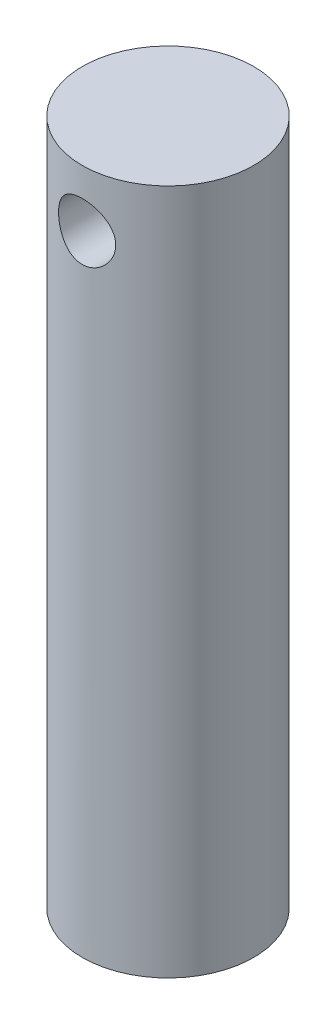
ISO-10303-21;
HEADER;
FILE_DESCRIPTION(('STEP AP214'),'2;1');
FILE_NAME('part.step','',(''),(''),'','','');
FILE_SCHEMA(('AUTOMOTIVE_DESIGN { 1 0 10303 214 1 1 1 1 }'));
ENDSEC;
DATA;
#1=APPLICATION_CONTEXT('core data for automotive mechanical design processes');
#2=APPLICATION_PROTOCOL_DEFINITION('international standard','automotive_design',2000,#1);
#3=PRODUCT_CONTEXT('',#1,'mechanical');
#4=PRODUCT('Part','Part','',(#3));
#5=PRODUCT_RELATED_PRODUCT_CATEGORY('part','',(#4));
#6=PRODUCT_DEFINITION_FORMATION('','',#4);
#7=PRODUCT_DEFINITION_CONTEXT('part definition',#1,'design');
#8=PRODUCT_DEFINITION('design','',#6,#7);
#9=PRODUCT_DEFINITION_SHAPE('','',#8);
#10=(LENGTH_UNIT() NAMED_UNIT(*) SI_UNIT(.MILLI.,.METRE.));
#11=(NAMED_UNIT(*) PLANE_ANGLE_UNIT() SI_UNIT($,.RADIAN.));
#12=(NAMED_UNIT(*) SI_UNIT($,.STERADIAN.) SOLID_ANGLE_UNIT());
#13=UNCERTAINTY_MEASURE_WITH_UNIT(LENGTH_MEASURE(1.E-05),#10,'distance_accuracy_value','');
#14=(GEOMETRIC_REPRESENTATION_CONTEXT(3) GLOBAL_UNCERTAINTY_ASSIGNED_CONTEXT((#13)) GLOBAL_UNIT_ASSIGNED_CONTEXT((#10,
#11,#12)) REPRESENTATION_CONTEXT('',''));
#15=CARTESIAN_POINT('',(0.,0.,0.));
#16=DIRECTION('',(0.,0.,1.));
#17=DIRECTION('',(1.,0.,0.));
#18=AXIS2_PLACEMENT_3D('',#15,#16,#17);
#19=CARTESIAN_POINT('',(0.,600.,0.));
#20=DIRECTION('',(0.,-1.,0.));
#21=DIRECTION('',(0.,0.,-1.));
#22=AXIS2_PLACEMENT_3D('',#19,#20,#21);
#23=CYLINDRICAL_SURFACE('',#22,75.);
#24=CARTESIAN_POINT('',(0.,575.,-75.));
#25=CARTESIAN_POINT('',(-0.682043563109411,575.000000281202,-75.0000001834636));
#26=CARTESIAN_POINT('',(-1.36408304916086,574.972066630301,-74.9906750346958));
#27=CARTESIAN_POINT('',(-2.72309062655188,574.86060349026,-74.9536313305163));
#28=CARTESIAN_POINT('',(-3.40005875906055,574.777074452937,-74.9259129245845));
#29=CARTESIAN_POINT('',(-4.74402781816825,574.555205586026,-74.852836749776));
#30=CARTESIAN_POINT('',(-5.41102796618303,574.416861497897,-74.8074776104087));
#31=CARTESIAN_POINT('',(-6.73027957356999,574.086629626201,-74.7003437610052));
#32=CARTESIAN_POINT('',(-7.38253093274908,573.894741479012,-74.6385689394884));
#33=CARTESIAN_POINT('',(-8.66673818011844,573.45946596057,-74.5003628053537));
#34=CARTESIAN_POINT('',(-9.2987269417531,573.216167431924,-74.4239567980684));
#35=CARTESIAN_POINT('',(-10.5394907998742,572.679857633823,-74.2584063686388));
#36=CARTESIAN_POINT('',(-11.1482659624174,572.386846505844,-74.1692619827463));
#37=CARTESIAN_POINT('',(-12.3389551597216,571.753276330204,-73.9804948316014));
#38=CARTESIAN_POINT('',(-12.9208652540418,571.412710336717,-73.8808705361871));
#39=CARTESIAN_POINT('',(-14.054294697475,570.686467156375,-73.6736642826246));
#40=CARTESIAN_POINT('',(-14.6058132850364,570.300788839847,-73.5660821252261));
#41=CARTESIAN_POINT('',(-15.6920909239394,569.474045311492,-73.3421793403497));
#42=CARTESIAN_POINT('',(-16.2257890481614,569.031626754044,-73.2256907515636));
#43=CARTESIAN_POINT('',(-16.997046245371,568.336311758575,-73.0490936667679));
#44=CARTESIAN_POINT('',(-17.2492628938853,568.099245506629,-72.9899140882099));
#45=CARTESIAN_POINT('',(-17.7436742741242,567.614818226839,-72.8713019644221));
#46=CARTESIAN_POINT('',(-17.9858665374623,567.367454693136,-72.8118693608145));
#47=CARTESIAN_POINT('',(-18.6967642907861,566.610542173006,-72.6338050100808));
#48=CARTESIAN_POINT('',(-19.1498502873156,566.086117574569,-72.5153929461569));
#49=CARTESIAN_POINT('',(-20.0112963600764,565.000931067295,-72.2824129533261));
#50=CARTESIAN_POINT('',(-20.419656643914,564.440169327144,-72.1678450065775));
#51=CARTESIAN_POINT('',(-21.0021289120157,563.566060488429,-71.9996736602132));
#52=CARTESIAN_POINT('',(-21.1937292728482,563.264742433966,-71.9434719995578));
#53=CARTESIAN_POINT('',(-21.5639770024164,562.653948776773,-71.833363944514));
#54=CARTESIAN_POINT('',(-21.7426274852462,562.344475159807,-71.7794569996042));
#55=CARTESIAN_POINT('',(-22.2587291653832,561.404380781866,-71.6217741443237));
#56=CARTESIAN_POINT('',(-22.5763641930188,560.762036088602,-71.5220264055396));
#57=CARTESIAN_POINT('',(-23.1558370084906,559.450973910466,-71.3365252223791));
#58=CARTESIAN_POINT('',(-23.4176880867469,558.78226275245,-71.2507684458253));
#59=CARTESIAN_POINT('',(-23.8833575556511,557.423016669667,-71.0960301875004));
#60=CARTESIAN_POINT('',(-24.0871785581008,556.73248272865,-71.0270479507657));
#61=CARTESIAN_POINT('',(-24.4289109763763,555.35840813644,-70.9102237330429));
#62=CARTESIAN_POINT('',(-24.5688117194695,554.675415779862,-70.8617477779742));
#63=CARTESIAN_POINT('',(-24.7911720822714,553.299043392663,-70.7842616932367));
#64=CARTESIAN_POINT('',(-24.873632895037,552.605663578101,-70.7552511592615));
#65=CARTESIAN_POINT('',(-24.9802500996108,551.21406813829,-70.7176803518508));
#66=CARTESIAN_POINT('',(-25.0044220685952,550.515853855041,-70.709114614731));
#67=CARTESIAN_POINT('',(-24.9942512753776,549.119915662094,-70.7127106595401));
#68=CARTESIAN_POINT('',(-24.9599101642946,548.422191739113,-70.7248718565975));
#69=CARTESIAN_POINT('',(-24.8359880589053,547.064546278223,-70.7684797128405));
#70=CARTESIAN_POINT('',(-24.7490073200895,546.404356175383,-70.79901820523));
#71=CARTESIAN_POINT('',(-24.5229215709178,545.094054363806,-70.8776454461219));
#72=CARTESIAN_POINT('',(-24.3838183868932,544.443942302772,-70.9257335796966));
#73=CARTESIAN_POINT('',(-24.0547093125451,543.158112935513,-71.0380260010566));
#74=CARTESIAN_POINT('',(-23.8646992143096,542.522396823954,-71.1022316210687));
#75=CARTESIAN_POINT('',(-23.4353812932918,541.269506928207,-71.2448877174833));
#76=CARTESIAN_POINT('',(-23.1960721614449,540.652333636895,-71.3233385721408));
#77=CARTESIAN_POINT('',(-22.6657350080684,539.430468969774,-71.4936585294983));
#78=CARTESIAN_POINT('',(-22.3739377450668,538.826137500952,-71.5857229839322));
#79=CARTESIAN_POINT('',(-21.9012134949576,537.939773188544,-71.7311925034584));
#80=CARTESIAN_POINT('',(-21.7377918910674,537.647660190712,-71.7809137455381));
#81=CARTESIAN_POINT('',(-21.3994922936759,537.070434952941,-71.8824939586225));
#82=CARTESIAN_POINT('',(-21.2246117957602,536.785324262248,-71.9343533960191));
#83=CARTESIAN_POINT('',(-20.6832345812266,535.941171409029,-72.0926154985117));
#84=CARTESIAN_POINT('',(-20.2999786221414,535.393264395711,-72.2017092681118));
#85=CARTESIAN_POINT('',(-19.4912940646186,534.330431041641,-72.4242034100678));
#86=CARTESIAN_POINT('',(-19.065863975155,533.815505867991,-72.5376039345974));
#87=CARTESIAN_POINT('',(-18.3864103798326,533.05705917426,-72.7117489086873));
#88=CARTESIAN_POINT('',(-18.1466543586881,532.800518492736,-72.7719904513457));
#89=CARTESIAN_POINT('',(-17.6566121114811,532.297818078898,-72.8924393524401));
#90=CARTESIAN_POINT('',(-17.4063283596204,532.051655934375,-72.9526467155748));
#91=CARTESIAN_POINT('',(-16.6401117339339,531.329182979027,-73.1326316378779));
#92=CARTESIAN_POINT('',(-16.1087833639113,530.868852024296,-73.2517798327651));
#93=CARTESIAN_POINT('',(-15.0085818114725,529.994086453637,-73.4850920999277));
#94=CARTESIAN_POINT('',(-14.4397046570499,529.579656705714,-73.5992556427848));
#95=CARTESIAN_POINT('',(-13.2679127368396,528.799579986111,-73.819494651593));
#96=CARTESIAN_POINT('',(-12.6649982157431,528.433932663805,-73.9255701756753));
#97=CARTESIAN_POINT('',(-11.4228250318291,527.750809483968,-74.1277202605017));
#98=CARTESIAN_POINT('',(-10.7832636501069,527.433850921548,-74.2236844190991));
#99=CARTESIAN_POINT('',(-9.47771346683198,526.855178772997,-74.4016593358158));
#100=CARTESIAN_POINT('',(-8.81172432707068,526.593465894141,-74.4836699152933));
#101=CARTESIAN_POINT('',(-7.45830492187188,526.12772121586,-74.6313398868872));
#102=CARTESIAN_POINT('',(-6.7708807568148,525.923673168491,-74.6970038842794));
#103=CARTESIAN_POINT('',(-5.37962867496845,525.575140036193,-74.8100699301734));
#104=CARTESIAN_POINT('',(-4.67580151473701,525.430652209882,-74.8574728191741));
#105=CARTESIAN_POINT('',(-3.28807672782372,525.20764593431,-74.9309699436454));
#106=CARTESIAN_POINT('',(-2.60463843291338,525.126538419255,-74.9578990919435));
#107=CARTESIAN_POINT('',(-1.23292734578024,525.020948214852,-74.9930031690901));
#108=CARTESIAN_POINT('',(-0.544654694045821,524.996463886783,-75.001178640685));
#109=CARTESIAN_POINT('',(0.831420089689477,525.00435846384,-74.9985472444385));
#110=CARTESIAN_POINT('',(1.51922227695571,525.036728802602,-74.9877432362589));
#111=CARTESIAN_POINT('',(2.88926550971048,525.157998028435,-74.9474602198848));
#112=CARTESIAN_POINT('',(3.57150661128805,525.24689634465,-74.9179814002808));
#113=CARTESIAN_POINT('',(4.905692902917,525.476968625908,-74.8422852599859));
#114=CARTESIAN_POINT('',(5.55794265508157,525.616550260369,-74.7965786528855));
#115=CARTESIAN_POINT('',(6.84798644252094,525.946966349266,-74.6895174337568));
#116=CARTESIAN_POINT('',(7.48578083352989,526.137799540958,-74.6281632072594));
#117=CARTESIAN_POINT('',(8.74283207145607,526.56915527054,-74.4913597379428));
#118=CARTESIAN_POINT('',(9.36208731817853,526.809682083629,-74.4159092824627));
#119=CARTESIAN_POINT('',(10.5781511094928,527.338525242007,-74.25280595869));
#120=CARTESIAN_POINT('',(11.1749590199595,527.626842936122,-74.1651527460044));
#121=CARTESIAN_POINT('',(12.3580261922201,528.257412679975,-73.9773423147337));
#122=CARTESIAN_POINT('',(12.9435958091378,528.600883230655,-73.8769169808463));
#123=CARTESIAN_POINT('',(13.7986502989285,529.150248889151,-73.7202914105832));
#124=CARTESIAN_POINT('',(14.0797992454848,529.339074858367,-73.6670820171242));
#125=CARTESIAN_POINT('',(14.634050391862,529.727872005998,-73.5589851007624));
#126=CARTESIAN_POINT('',(14.9071507637923,529.927845686774,-73.5040972023389));
#127=CARTESIAN_POINT('',(15.7137307029732,530.543987475894,-73.3374392742958));
#128=CARTESIAN_POINT('',(16.2345200648313,530.976396241948,-73.2236692804721));
#129=CARTESIAN_POINT('',(17.2390522633139,531.881714258543,-72.9937029966343));
#130=CARTESIAN_POINT('',(17.7227941301181,532.354624568637,-72.8775066432047));
#131=CARTESIAN_POINT('',(18.4290370243459,533.103386597144,-72.7009843095927));
#132=CARTESIAN_POINT('',(18.6660685958202,533.365614110157,-72.640450603467));
#133=CARTESIAN_POINT('',(19.1288083165228,533.899889113788,-72.5199685168573));
#134=CARTESIAN_POINT('',(19.3545191259199,534.171934271361,-72.4600200015562));
#135=CARTESIAN_POINT('',(20.0142374861073,535.002333255599,-72.2816563222532));
#136=CARTESIAN_POINT('',(20.4308640776165,535.574985697855,-72.1647146593224));
#137=CARTESIAN_POINT('',(21.2146058778503,536.754545708368,-71.9382167205842));
#138=CARTESIAN_POINT('',(21.5817192919298,537.361454517144,-71.8286607125479));
#139=CARTESIAN_POINT('',(22.2637288544633,538.605720496069,-71.62020361494));
#140=CARTESIAN_POINT('',(22.5786259090552,539.243077137593,-71.5213023404817));
#141=CARTESIAN_POINT('',(23.1530379513559,540.542697116014,-71.3374213013824));
#142=CARTESIAN_POINT('',(23.4126611638089,541.204908738887,-71.2524144091771));
#143=CARTESIAN_POINT('',(23.8749983682163,542.550792076995,-71.0988316549189));
#144=CARTESIAN_POINT('',(24.0777121681878,543.234463864619,-71.0302558482961));
#145=CARTESIAN_POINT('',(24.424198622974,544.617917039961,-70.9118614022397));
#146=CARTESIAN_POINT('',(24.5679935067317,545.317692246743,-70.8620356893462));
#147=CARTESIAN_POINT('',(24.7952587358922,546.72810584243,-70.782834772265));
#148=CARTESIAN_POINT('',(24.8787321213794,547.438743682036,-70.7534585374668));
#149=CARTESIAN_POINT('',(24.9817457004329,548.828415967245,-70.7171488916618));
#150=CARTESIAN_POINT('',(25.004352346477,549.507196736511,-70.7091392426977));
#151=CARTESIAN_POINT('',(24.9942676756856,550.864281233426,-70.712704882972));
#152=CARTESIAN_POINT('',(24.9615783456059,551.542584977337,-70.724279468559));
#153=CARTESIAN_POINT('',(24.8412320095267,552.893638724134,-70.766639253225));
#154=CARTESIAN_POINT('',(24.7535784284975,553.566389070419,-70.7974232553131));
#155=CARTESIAN_POINT('',(24.5241549685574,554.901490903276,-70.8772215873113));
#156=CARTESIAN_POINT('',(24.3823849166255,555.563842356592,-70.9262359755076));
#157=CARTESIAN_POINT('',(24.0492503260876,556.861006629382,-71.0398751986922));
#158=CARTESIAN_POINT('',(23.8588825598618,557.496103713742,-71.1041846928451));
#159=CARTESIAN_POINT('',(23.4289341274567,558.74773797922,-71.2470091657171));
#160=CARTESIAN_POINT('',(23.1893543731931,559.36427550401,-71.325523881205));
#161=CARTESIAN_POINT('',(22.6627859748553,560.575163442805,-71.494577034191));
#162=CARTESIAN_POINT('',(22.3757893476576,561.169510100055,-71.5851174958442));
#163=CARTESIAN_POINT('',(21.7564744266566,562.332474798277,-71.7757673164203));
#164=CARTESIAN_POINT('',(21.4241544890965,562.90109190511,-71.8758770223551));
#165=CARTESIAN_POINT('',(20.7008573285621,564.033721820906,-72.0876031729989));
#166=CARTESIAN_POINT('',(20.3079531427272,564.596450712472,-72.1995311221473));
#167=CARTESIAN_POINT('',(19.6854290942786,565.414323367691,-72.370782835824));
#168=CARTESIAN_POINT('',(19.4723800811053,565.68259195639,-72.4284300731229));
#169=CARTESIAN_POINT('',(19.0354736837794,566.210121920355,-72.5444818740063));
#170=CARTESIAN_POINT('',(18.8116137734136,566.469381165807,-72.6028866122433));
#171=CARTESIAN_POINT('',(18.1243577926126,567.233009899806,-72.7786453215333));
#172=CARTESIAN_POINT('',(17.6452591265925,567.723264986679,-72.8965511095064));
#173=CARTESIAN_POINT('',(16.6482057618157,568.662972328376,-73.1307006826635));
#174=CARTESIAN_POINT('',(16.1302507495481,569.112424253916,-73.2469444544285));
#175=CARTESIAN_POINT('',(15.3160765068676,569.76220501363,-73.4200169892604));
#176=CARTESIAN_POINT('',(15.0328433222103,569.978504668062,-73.478566786181));
#177=CARTESIAN_POINT('',(14.4572405045122,570.398901834738,-73.5939831879275));
#178=CARTESIAN_POINT('',(14.1648730566885,570.603002231922,-73.6508501890901));
#179=CARTESIAN_POINT('',(13.2745815728358,571.19655892762,-73.8183573231869));
#180=CARTESIAN_POINT('',(12.6634280954844,571.567302899787,-73.9259122425388));
#181=CARTESIAN_POINT('',(11.4103488270383,572.25567354728,-74.129662678448));
#182=CARTESIAN_POINT('',(10.7684292405709,572.573310875155,-74.2258604719667));
#183=CARTESIAN_POINT('',(9.45803560059031,573.152941103816,-74.4041840010504));
#184=CARTESIAN_POINT('',(8.78956292433632,573.414936886162,-74.486310465298));
#185=CARTESIAN_POINT('',(7.46128971124123,573.870481722736,-74.630793567644));
#186=CARTESIAN_POINT('',(6.80243588202987,574.066565693947,-74.6938695005434));
#187=CARTESIAN_POINT('',(5.46950089439773,574.404039498885,-74.8032862174244));
#188=CARTESIAN_POINT('',(4.79542023653629,574.54543112778,-74.8496275506829));
#189=CARTESIAN_POINT('',(3.43706552511666,574.772174027218,-74.9242893320059));
#190=CARTESIAN_POINT('',(2.75279386252671,574.857538237267,-74.9526139409776));
#191=CARTESIAN_POINT('',(1.37901340142224,574.971451003272,-74.9904691563562));
#192=CARTESIAN_POINT('',(0.689504617338183,574.999999715722,-74.9999998145295));
#193=CARTESIAN_POINT('',(0.,575.,-75.));
#194=B_SPLINE_CURVE_WITH_KNOTS('',3,(#24,#25,#26,#27,#28,#29,#30,#31,#32,#33,#34,#35,#36,#37,
#38,#39,#40,#41,#42,#43,#44,#45,#46,#47,#48,#49,#50,#51,#52,#53,#54,#55,#56,#57,#58,#59,#60,#61,
#62,#63,#64,#65,#66,#67,#68,#69,#70,#71,#72,#73,#74,#75,#76,#77,#78,#79,#80,#81,#82,#83,#84,#85,
#86,#87,#88,#89,#90,#91,#92,#93,#94,#95,#96,#97,#98,#99,#100,#101,#102,#103,#104,#105,#106,#107,
#108,#109,#110,#111,#112,#113,#114,#115,#116,#117,#118,#119,#120,#121,#122,#123,#124,#125,#126,
#127,#128,#129,#130,#131,#132,#133,#134,#135,#136,#137,#138,#139,#140,#141,#142,#143,#144,#145,
#146,#147,#148,#149,#150,#151,#152,#153,#154,#155,#156,#157,#158,#159,#160,#161,#162,#163,#164,
#165,#166,#167,#168,#169,#170,#171,#172,#173,#174,#175,#176,#177,#178,#179,#180,#181,#182,#183,
#184,#185,#186,#187,#188,#189,#190,#191,#192,#193),.UNSPECIFIED.,.T.,.F.,(4,2,2,2,2,2,2,2,2,2,2,
2,2,2,2,2,2,2,2,2,2,2,2,2,2,2,2,2,2,2,2,2,2,2,2,2,2,2,2,2,2,2,2,2,2,2,2,2,2,2,2,2,2,2,2,2,2,2,2,
2,2,2,2,2,2,2,2,2,2,2,2,2,2,2,2,2,2,2,2,2,2,2,2,2,4),(0.,2.04549108001866,4.09096553676624,
6.13659893608049,8.18224622784603,10.2243869189781,12.2665217985551,14.3089552632997,
16.3514398841596,18.4576962856669,19.5109360455847,20.5644336288988,22.6711854870895,
24.7779275658136,25.8620480619015,26.9459069855851,29.1134413481503,31.2804587208075,
33.4473785455136,35.5412876392246,37.6351532400667,39.7284592118682,41.8217061158565,
43.8191456437848,45.8165151894739,47.8140498865896,49.8116376321865,51.8413229504077,
52.8562642771743,53.8714281705366,55.9016049419061,57.931853513842,59.0003750321555,
60.0686468170587,62.2050533722456,64.3416862852946,66.4783038402626,68.6362496637018,
70.7942231123077,72.9515879114232,75.1088534022356,77.1725684100928,79.2362236916498,
81.299568066371,83.3628916044167,85.3663222396702,87.3697035185469,89.373257222384,
91.3768674830872,93.4331444713402,94.4613906112772,95.4898685015544,97.5467128261631,
99.6036109759403,100.679204052578,101.754543189192,103.905075004321,106.055684746285,
108.206257163679,110.352579282526,112.498908641865,114.644427486273,116.789838193225,
118.824943015843,120.859974719751,122.894879627957,124.929791042207,126.925917091913,
128.922006156024,130.918431625578,132.91492951948,134.998557644853,136.040490005586,
137.082667026973,139.166889163095,141.251128117494,142.334309450023,143.417233604746,
145.582925564431,147.748182590008,149.913327454023,151.981746146051,154.050096940562,
156.117969882205,158.185837128055),.UNSPECIFIED.);
#195=CARTESIAN_POINT('',(0.,575.,-75.));
#196=VERTEX_POINT('',#195);
#197=EDGE_CURVE('E10',#196,#196,#194,.T.);
#198=ORIENTED_EDGE('',*,*,#197,.T.);
#199=EDGE_LOOP('',(#198));
#200=FACE_BOUND('',#199,.T.);
#201=CARTESIAN_POINT('',(25.0000000000001,550.,70.7106781186547));
#202=CARTESIAN_POINT('',(25.0000002905048,549.31914529342,70.7106778950988));
#203=CARTESIAN_POINT('',(24.972163123343,548.638294743538,70.7205384082539));
#204=CARTESIAN_POINT('',(24.8610943853675,547.281699610562,70.7596596623775));
#205=CARTESIAN_POINT('',(24.7778632142728,546.605954990661,70.7889202633563));
#206=CARTESIAN_POINT('',(24.5568065668124,545.26444738065,70.8659079550308));
#207=CARTESIAN_POINT('',(24.4189739218801,544.598685713108,70.9136374704705));
#208=CARTESIAN_POINT('',(24.0900031573892,543.281943728838,71.0260650188068));
#209=CARTESIAN_POINT('',(23.8988645794935,542.630963539257,71.0907631976037));
#210=CARTESIAN_POINT('',(23.465398463372,541.349467547839,71.2350130583448));
#211=CARTESIAN_POINT('',(23.2231745119017,540.718913268466,71.3145346452564));
#212=CARTESIAN_POINT('',(22.6892737023302,539.480907465289,71.4861904894017));
#213=CARTESIAN_POINT('',(22.3975969925086,538.873455872222,71.5783247088172));
#214=CARTESIAN_POINT('',(21.7669109510884,537.685208028436,71.7726300786875));
#215=CARTESIAN_POINT('',(21.4278937432057,537.104416234656,71.8748028984762));
#216=CARTESIAN_POINT('',(20.7048826041899,535.972932386585,72.0864042278168));
#217=CARTESIAN_POINT('',(20.3208874434561,535.422241155784,72.1958329356937));
#218=CARTESIAN_POINT('',(19.4959470435702,534.335069515787,72.4230451906923));
#219=CARTESIAN_POINT('',(19.0534630630533,533.799789294909,72.5409874455801));
#220=CARTESIAN_POINT('',(18.1257009001659,532.768044053839,72.7783497638775));
#221=CARTESIAN_POINT('',(17.6404218247488,532.271579844067,72.897769858082));
#222=CARTESIAN_POINT('',(16.6299627800379,531.320443845132,73.1349002504791));
#223=CARTESIAN_POINT('',(16.1047766851179,530.865778495754,73.2526102828651));
#224=CARTESIAN_POINT('',(15.0177288069339,530.001247532193,73.483171487966));
#225=CARTESIAN_POINT('',(14.4558666767878,529.591382341828,73.5960226147087));
#226=CARTESIAN_POINT('',(13.2837211191846,528.809151341475,73.8167159840747));
#227=CARTESIAN_POINT('',(12.6725555111639,528.438046965378,73.9243499724011));
#228=CARTESIAN_POINT('',(11.4191909295395,527.748852785535,74.128301991135));
#229=CARTESIAN_POINT('',(10.7769912564603,527.43076417743,74.2246197663189));
#230=CARTESIAN_POINT('',(9.46612023751601,526.850350915807,74.4031583831655));
#231=CARTESIAN_POINT('',(8.7974544429863,526.588014640857,74.4853821619931));
#232=CARTESIAN_POINT('',(7.43838739678039,526.121421398038,74.6333538833669));
#233=CARTESIAN_POINT('',(6.74798707716808,525.917161943361,74.6991025313524));
#234=CARTESIAN_POINT('',(5.37503029481823,525.57476578286,74.8102050121057));
#235=CARTESIAN_POINT('',(4.69303653716876,525.434575928394,74.8561887905591));
#236=CARTESIAN_POINT('',(3.31875501323107,525.211486071131,74.929695711808));
#237=CARTESIAN_POINT('',(2.6264674645984,525.128584858756,74.9572192443678));
#238=CARTESIAN_POINT('',(1.23704408416943,525.020905830528,74.993016762765));
#239=CARTESIAN_POINT('',(0.539909361449459,524.996115130701,75.001295015566));
#240=CARTESIAN_POINT('',(-0.853944505265173,525.004871059726,74.9983762571751));
#241=CARTESIAN_POINT('',(-1.55066365850778,525.038416337943,74.9871796968774));
#242=CARTESIAN_POINT('',(-2.91101012746152,525.161039371296,74.9464529595546));
#243=CARTESIAN_POINT('',(-3.57486228535946,525.247883987561,74.9176602240251));
#244=CARTESIAN_POINT('',(-4.89252326214549,525.474297655795,74.8431603599659));
#245=CARTESIAN_POINT('',(-5.54633239063485,525.613865079043,74.7974537539424));
#246=CARTESIAN_POINT('',(-6.83949116877275,525.944506389571,74.6903095410896));
#247=CARTESIAN_POINT('',(-7.47884028036368,526.135582190071,74.6288713499322));
#248=CARTESIAN_POINT('',(-8.7388619289851,526.567630022038,74.4918385969254));
#249=CARTESIAN_POINT('',(-9.3595340513401,526.808603160415,74.4162437210313));
#250=CARTESIAN_POINT('',(-10.5864011754736,527.342081243865,74.2517075327204));
#251=CARTESIAN_POINT('',(-11.1922996928288,527.635220373701,74.1626042363106));
#252=CARTESIAN_POINT('',(-12.0808553093815,528.110143310438,74.0212338058597));
#253=CARTESIAN_POINT('',(-12.3736722452885,528.274328844025,73.972821870832));
#254=CARTESIAN_POINT('',(-12.9522432444177,528.614210909204,73.8737134440178));
#255=CARTESIAN_POINT('',(-13.2379957328101,528.789909976124,73.8230164498239));
#256=CARTESIAN_POINT('',(-14.0839580257333,529.333806738497,73.6679759149813));
#257=CARTESIAN_POINT('',(-14.632925457052,529.718832238592,73.5606743353039));
#258=CARTESIAN_POINT('',(-15.6975357487705,530.531159924366,73.3408679407032));
#259=CARTESIAN_POINT('',(-16.2131773954905,530.958463648328,73.2283629365341));
#260=CARTESIAN_POINT('',(-16.9711588117692,531.639648493523,73.0551247705384));
#261=CARTESIAN_POINT('',(-17.2266996755643,531.879199188063,72.9952540405157));
#262=CARTESIAN_POINT('',(-17.7274037306057,532.368728773069,72.8752729862871));
#263=CARTESIAN_POINT('',(-17.97256935883,532.618705187002,72.8151627220144));
#264=CARTESIAN_POINT('',(-18.6920684774189,533.383843145033,72.6350533725481));
#265=CARTESIAN_POINT('',(-19.1504380227849,533.91424380767,72.5152679177101));
#266=CARTESIAN_POINT('',(-20.0214325658877,535.012221558447,72.2796372227636));
#267=CARTESIAN_POINT('',(-20.434050274279,535.579804547758,72.1637926125568));
#268=CARTESIAN_POINT('',(-21.2107203001018,536.748674283221,71.9393408849804));
#269=CARTESIAN_POINT('',(-21.5747727236254,537.349960955743,71.8307337518005));
#270=CARTESIAN_POINT('',(-22.2564606375485,538.591296699378,71.6224746830576));
#271=CARTESIAN_POINT('',(-22.5733565170826,539.231777647887,71.5229733138214));
#272=CARTESIAN_POINT('',(-23.1517819050703,540.539240265165,71.337839074629));
#273=CARTESIAN_POINT('',(-23.4133105793182,541.206222333041,71.2522064136343));
#274=CARTESIAN_POINT('',(-23.8785459714181,542.561701273017,71.0976453739301));
#275=CARTESIAN_POINT('',(-24.0822725622903,543.250190660058,71.0287112552647));
#276=CARTESIAN_POINT('',(-24.4300136068168,544.643691438056,70.9098602842714));
#277=CARTESIAN_POINT('',(-24.5740311400131,545.348701974939,70.8599424511744));
#278=CARTESIAN_POINT('',(-24.7957359387031,546.73756634385,70.7826575329924));
#279=CARTESIAN_POINT('',(-24.876123336348,547.420939094897,70.7543744112564));
#280=CARTESIAN_POINT('',(-24.9802909920552,548.792512302844,70.7176650535869));
#281=CARTESIAN_POINT('',(-25.0040729509708,549.480712614065,70.7092382210212));
#282=CARTESIAN_POINT('',(-24.9947894745456,550.856564958777,70.712520204468));
#283=CARTESIAN_POINT('',(-24.9617332689555,551.544217063149,70.724225751254));
#284=CARTESIAN_POINT('',(-24.8391282248061,552.913831218275,70.7673789273648));
#285=CARTESIAN_POINT('',(-24.7495800808114,553.595793338884,70.7988263139651));
#286=CARTESIAN_POINT('',(-24.5189307791513,554.925614567914,70.8790260904523));
#287=CARTESIAN_POINT('',(-24.3797104296552,555.573839498244,70.9271454967158));
#288=CARTESIAN_POINT('',(-24.0506762464121,556.855868720633,71.0393915689662));
#289=CARTESIAN_POINT('',(-23.8608638460667,557.489673420701,71.1035177814363));
#290=CARTESIAN_POINT('',(-23.4321907792834,558.738911983189,71.2459359730088));
#291=CARTESIAN_POINT('',(-23.1933237550122,559.354343452452,71.3242297881783));
#292=CARTESIAN_POINT('',(-22.6684097765603,560.563020767878,71.4927908973219));
#293=CARTESIAN_POINT('',(-22.3823612586357,561.156265877916,71.5830585881287));
#294=CARTESIAN_POINT('',(-21.7552705541065,562.335645157307,71.7761739652141));
#295=CARTESIAN_POINT('',(-21.4127724216555,562.920957649887,71.8793297457079));
#296=CARTESIAN_POINT('',(-20.8648762826391,563.77576056342,72.0395247173946));
#297=CARTESIAN_POINT('',(-20.6765418515321,564.056848190958,72.0938362835621));
#298=CARTESIAN_POINT('',(-20.2887235452391,564.611026354831,72.2039358093552));
#299=CARTESIAN_POINT('',(-20.0892371669321,564.884115074632,72.2597240989488));
#300=CARTESIAN_POINT('',(-19.4745412848703,565.69073736662,72.4287431468025));
#301=CARTESIAN_POINT('',(-19.0430729137027,566.211661563052,72.5436346187718));
#302=CARTESIAN_POINT('',(-18.1395250253052,567.216685846098,72.7748239834714));
#303=CARTESIAN_POINT('',(-17.6674445666347,567.700785078572,72.8911219087514));
#304=CARTESIAN_POINT('',(-16.9191698739333,568.408345825729,73.0671720870939));
#305=CARTESIAN_POINT('',(-16.6566291037492,568.646238369126,73.1275040317569));
#306=CARTESIAN_POINT('',(-16.1216334958449,569.110688160349,73.2473076707586));
#307=CARTESIAN_POINT('',(-15.8491809979369,569.33724805381,73.3067795635518));
#308=CARTESIAN_POINT('',(-15.0174217667545,569.999480640882,73.4833185143156));
#309=CARTESIAN_POINT('',(-14.4436777737723,570.417739830812,73.5985172897798));
#310=CARTESIAN_POINT('',(-13.2616471299598,571.20454953428,73.8206638642061));
#311=CARTESIAN_POINT('',(-12.6533606454725,571.573100287165,73.9276117028956));
#312=CARTESIAN_POINT('',(-11.4061209290371,572.257726152346,74.1302869258942));
#313=CARTESIAN_POINT('',(-10.7671683565366,572.573802392409,74.226014551332));
#314=CARTESIAN_POINT('',(-9.4672632324412,573.14892500076,74.4029456063809));
#315=CARTESIAN_POINT('',(-8.80648360328948,573.40833380652,74.4842406777716));
#316=CARTESIAN_POINT('',(-7.46362812623592,573.870450698888,74.6307601246623));
#317=CARTESIAN_POINT('',(-6.78155225444415,574.073158721886,74.6959844821336));
#318=CARTESIAN_POINT('',(-5.40139523385377,574.419890167481,74.8084495359781));
#319=CARTESIAN_POINT('',(-4.70331893231091,574.563931121147,74.8556956043998));
#320=CARTESIAN_POINT('',(-3.29640507093936,574.791964330935,74.9308338830054));
#321=CARTESIAN_POINT('',(-2.58756797573973,574.875959172237,74.9587269263981));
#322=CARTESIAN_POINT('',(-1.19829814830017,574.98051822595,74.9934932237063));
#323=CARTESIAN_POINT('',(-0.518097697824307,575.003880261016,75.0012934968657));
#324=CARTESIAN_POINT('',(0.841889780928481,574.995071314885,74.9983570316948));
#325=CARTESIAN_POINT('',(1.52167682224687,574.962902187252,74.9876209120874));
#326=CARTESIAN_POINT('',(2.87577485796675,574.843346604686,74.9479066281476));
#327=CARTESIAN_POINT('',(3.55008629188618,574.755964626869,74.9189299429132));
#328=CARTESIAN_POINT('',(4.8884046569216,574.526809955199,74.8435215277661));
#329=CARTESIAN_POINT('',(5.55241156160027,574.385037121823,74.7970897530785));
#330=CARTESIAN_POINT('',(6.85497108882216,574.051075144595,74.688886056406));
#331=CARTESIAN_POINT('',(7.49376073977927,573.859725664285,74.6273704555754));
#332=CARTESIAN_POINT('',(8.7526545770998,573.427206878977,74.4902139848623));
#333=CARTESIAN_POINT('',(9.37275906374207,573.186038375083,74.4145733421161));
#334=CARTESIAN_POINT('',(10.5905166993427,572.655728833766,74.2510501928728));
#335=CARTESIAN_POINT('',(11.1881668664316,572.366581452307,74.1631660677207));
#336=CARTESIAN_POINT('',(12.3573773748382,571.742457829778,73.9773326029338));
#337=CARTESIAN_POINT('',(12.9289368895446,571.407480138041,73.8793829447192));
#338=CARTESIAN_POINT('',(14.0633767830488,570.680708103553,73.6720163471709));
#339=CARTESIAN_POINT('',(14.6251561874007,570.2872717763,73.5623094286318));
#340=CARTESIAN_POINT('',(15.4415160396864,569.664101365532,73.3937117489171));
#341=CARTESIAN_POINT('',(15.7092652506047,569.45086248537,73.3368363686569));
#342=CARTESIAN_POINT('',(16.2357270284484,569.013633719476,73.2220851212605));
#343=CARTESIAN_POINT('',(16.4944374726385,568.789641337243,73.1642090238157));
#344=CARTESIAN_POINT('',(17.2563952140952,568.102068123061,72.9896451086561));
#345=CARTESIAN_POINT('',(17.7454859518732,567.62287821701,72.8720181142818));
#346=CARTESIAN_POINT('',(18.6827958396074,566.625921553503,72.6373640085026));
#347=CARTESIAN_POINT('',(19.1310144873585,566.10815432218,72.5203369044855));
#348=CARTESIAN_POINT('',(19.7789536872509,565.294430256115,72.3453226166178));
#349=CARTESIAN_POINT('',(19.9946442464015,565.011357803121,72.2859708983198));
#350=CARTESIAN_POINT('',(20.4138286868593,564.436143197843,72.1687116675656));
#351=CARTESIAN_POINT('',(20.6173254556567,564.144003217821,72.1108038151133));
#352=CARTESIAN_POINT('',(21.2090951937853,563.254484731902,71.9398564940707));
#353=CARTESIAN_POINT('',(21.5786785129299,562.643968856597,71.8295848185951));
#354=CARTESIAN_POINT('',(22.264863677326,561.392333025584,71.6198620544077));
#355=CARTESIAN_POINT('',(22.5814763193479,560.751219340811,71.5204087620837));
#356=CARTESIAN_POINT('',(23.159240629519,559.442512682255,71.335416505956));
#357=CARTESIAN_POINT('',(23.4203952708988,558.77492113029,71.2498767962707));
#358=CARTESIAN_POINT('',(23.8743694218221,557.448712194434,71.0990092273062));
#359=CARTESIAN_POINT('',(24.0697437135729,556.791052616201,71.0329426696092));
#360=CARTESIAN_POINT('',(24.4060262067674,555.460466907302,70.9181042819503));
#361=CARTESIAN_POINT('',(24.5469362997915,554.787541307696,70.8693318513561));
#362=CARTESIAN_POINT('',(24.7729144430816,553.431480698801,70.7906565810836));
#363=CARTESIAN_POINT('',(24.8579987954722,552.748348729607,70.7607482328513));
#364=CARTESIAN_POINT('',(24.971541314534,551.376809743166,70.7207591540581));
#365=CARTESIAN_POINT('',(24.9999997062748,550.688402746897,70.7106783446891));
#366=CARTESIAN_POINT('',(25.0000000000001,550.,70.7106781186547));
#367=B_SPLINE_CURVE_WITH_KNOTS('',3,(#201,#202,#203,#204,#205,#206,#207,#208,#209,#210,#211,
#212,#213,#214,#215,#216,#217,#218,#219,#220,#221,#222,#223,#224,#225,#226,#227,#228,#229,#230,
#231,#232,#233,#234,#235,#236,#237,#238,#239,#240,#241,#242,#243,#244,#245,#246,#247,#248,#249,
#250,#251,#252,#253,#254,#255,#256,#257,#258,#259,#260,#261,#262,#263,#264,#265,#266,#267,#268,
#269,#270,#271,#272,#273,#274,#275,#276,#277,#278,#279,#280,#281,#282,#283,#284,#285,#286,#287,
#288,#289,#290,#291,#292,#293,#294,#295,#296,#297,#298,#299,#300,#301,#302,#303,#304,#305,#306,
#307,#308,#309,#310,#311,#312,#313,#314,#315,#316,#317,#318,#319,#320,#321,#322,#323,#324,#325,
#326,#327,#328,#329,#330,#331,#332,#333,#334,#335,#336,#337,#338,#339,#340,#341,#342,#343,#344,
#345,#346,#347,#348,#349,#350,#351,#352,#353,#354,#355,#356,#357,#358,#359,#360,#361,#362,#363,
#364,#365,#366),.UNSPECIFIED.,.T.,.F.,(4,2,2,2,2,2,2,2,2,2,2,2,2,2,2,2,2,2,2,2,2,2,2,2,2,2,2,2,
2,2,2,2,2,2,2,2,2,2,2,2,2,2,2,2,2,2,2,2,2,2,2,2,2,2,2,2,2,2,2,2,2,2,2,2,2,2,2,2,2,2,2,2,2,2,2,2,
2,2,2,2,2,2,4),(0.,2.04192014901805,4.08382556384633,6.12599914704594,8.16819028987958,
10.2062795871813,12.2443627735704,14.2827854513365,16.3212638682196,18.4321730816831,
20.543126355956,22.6544043133091,24.7657022420287,26.9322303154504,29.0988072429487,
31.2649321090736,33.4309642092484,35.5216416200292,37.6122748874721,39.7024445863319,
41.7925658927881,43.8005848789178,45.8085418381521,47.8165733909991,49.8246494942801,
51.8590523340753,52.8763527790393,53.8938779955739,55.928747536643,57.9636911431893,
59.0294541109969,60.0949653426459,62.2258498037244,64.3570732785574,66.4882920976041,
68.6500399773975,70.811820425468,72.9728567254435,75.1337815543929,77.1971850567776,
79.2605265582147,81.3235330324825,83.3865141427198,85.3784780609928,87.3703855478575,
89.3625513634294,91.3547832189502,93.4101738968082,94.4379782673199,95.4660142682169,
97.5219621583015,99.5779577207527,100.655841326445,101.73347211192,103.888585318901,
106.043688148591,108.198744655406,110.339585592676,112.48042893161,114.620632067127,
116.76074305441,118.800186827069,120.839562526817,122.878772878179,124.917988460476,
126.924698745877,128.93137676534,130.938320330743,132.945327436626,135.026490646173,
136.067187824019,137.108127786632,139.189942739392,141.271783268463,142.353888212246,
143.435735892575,145.599280711818,147.762384006962,149.925371303876,151.99061170969,
154.055780381785,156.120345718602,158.184902849433),.UNSPECIFIED.);
#368=CARTESIAN_POINT('',(25.0000000000001,550.,70.7106781186547));
#369=VERTEX_POINT('',#368);
#370=EDGE_CURVE('E44',#369,#369,#367,.T.);
#371=ORIENTED_EDGE('',*,*,#370,.T.);
#372=EDGE_LOOP('',(#371));
#373=FACE_BOUND('',#372,.T.);
#374=CARTESIAN_POINT('',(0.,600.,0.));
#375=DIRECTION('',(0.,1.,0.));
#376=DIRECTION('',(0.,0.,1.));
#377=AXIS2_PLACEMENT_3D('',#374,#375,#376);
#378=CIRCLE('',#377,75.);
#379=CARTESIAN_POINT('',(0.,600.,75.));
#380=VERTEX_POINT('',#379);
#381=EDGE_CURVE('E48',#380,#380,#378,.T.);
#382=ORIENTED_EDGE('',*,*,#381,.F.);
#383=EDGE_LOOP('',(#382));
#384=FACE_BOUND('',#383,.T.);
#385=CARTESIAN_POINT('',(0.,0.,0.));
#386=DIRECTION('',(0.,1.,0.));
#387=DIRECTION('',(0.,0.,1.));
#388=AXIS2_PLACEMENT_3D('',#385,#386,#387);
#389=CIRCLE('',#388,75.);
#390=CARTESIAN_POINT('',(0.,0.,75.));
#391=VERTEX_POINT('',#390);
#392=EDGE_CURVE('E52',#391,#391,#389,.T.);
#393=ORIENTED_EDGE('',*,*,#392,.T.);
#394=EDGE_LOOP('',(#393));
#395=FACE_BOUND('',#394,.T.);
#396=ADVANCED_FACE('F33',(#200,#373,#384,#395),#23,.T.);
#397=CARTESIAN_POINT('',(0.,600.,0.));
#398=DIRECTION('',(0.,1.,0.));
#399=DIRECTION('',(0.,0.,1.));
#400=AXIS2_PLACEMENT_3D('',#397,#398,#399);
#401=PLANE('',#400);
#402=ORIENTED_EDGE('',*,*,#381,.T.);
#403=EDGE_LOOP('',(#402));
#404=FACE_BOUND('',#403,.T.);
#405=ADVANCED_FACE('F64',(#404),#401,.T.);
#406=CARTESIAN_POINT('',(0.,0.,0.));
#407=DIRECTION('',(0.,1.,0.));
#408=DIRECTION('',(0.,0.,1.));
#409=AXIS2_PLACEMENT_3D('',#406,#407,#408);
#410=PLANE('',#409);
#411=ORIENTED_EDGE('',*,*,#392,.F.);
#412=EDGE_LOOP('',(#411));
#413=FACE_BOUND('',#412,.T.);
#414=ADVANCED_FACE('F62',(#413),#410,.F.);
#415=CARTESIAN_POINT('',(0.,550.,-75.));
#416=DIRECTION('',(0.,0.,1.));
#417=DIRECTION('',(1.,0.,0.));
#418=AXIS2_PLACEMENT_3D('',#415,#416,#417);
#419=CYLINDRICAL_SURFACE('',#418,25.);
#420=ORIENTED_EDGE('',*,*,#370,.F.);
#421=EDGE_LOOP('',(#420));
#422=FACE_BOUND('',#421,.T.);
#423=ORIENTED_EDGE('',*,*,#197,.F.);
#424=EDGE_LOOP('',(#423));
#425=FACE_BOUND('',#424,.T.);
#426=ADVANCED_FACE('F58',(#422,#425),#419,.F.);
#427=CLOSED_SHELL('',(#396,#405,#414,#426));
#428=MANIFOLD_SOLID_BREP('B2',#427);
#429=ADVANCED_BREP_SHAPE_REPRESENTATION('',(#18,#428),#14);
#430=SHAPE_DEFINITION_REPRESENTATION(#9,#429);
ENDSEC;
END-ISO-10303-21;
